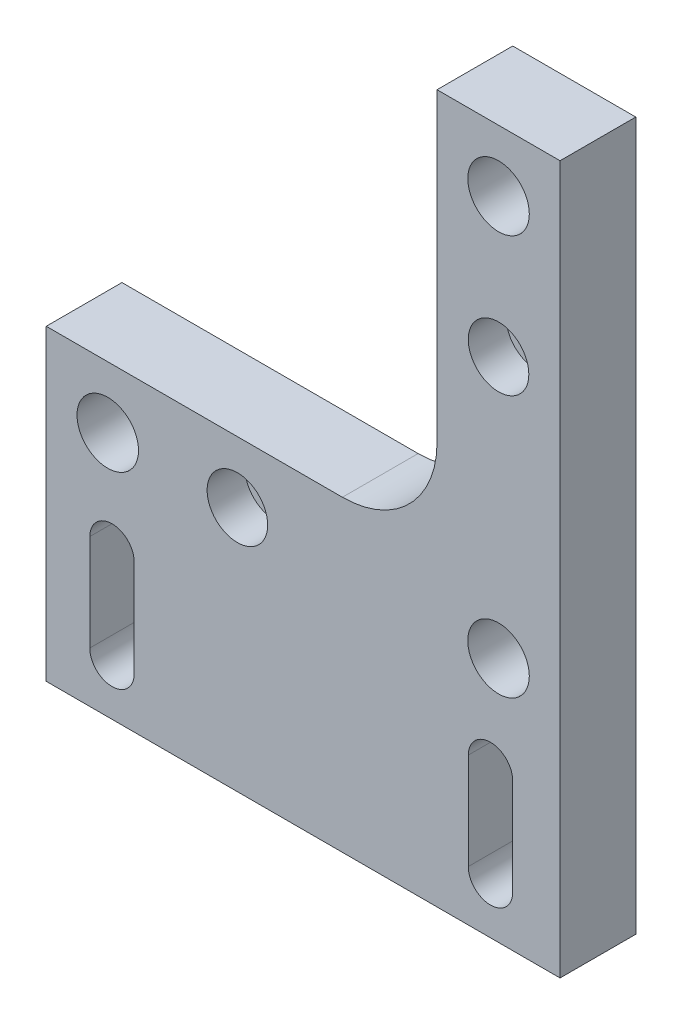
ISO-10303-21;
HEADER;
FILE_DESCRIPTION(('STEP AP214'),'2;1');
FILE_NAME('part.step','',(''),(''),'','','');
FILE_SCHEMA(('AUTOMOTIVE_DESIGN { 1 0 10303 214 1 1 1 1 }'));
ENDSEC;
DATA;
#1=APPLICATION_CONTEXT('core data for automotive mechanical design processes');
#2=APPLICATION_PROTOCOL_DEFINITION('international standard','automotive_design',2000,#1);
#3=PRODUCT_CONTEXT('',#1,'mechanical');
#4=PRODUCT('Part','Part','',(#3));
#5=PRODUCT_RELATED_PRODUCT_CATEGORY('part','',(#4));
#6=PRODUCT_DEFINITION_FORMATION('','',#4);
#7=PRODUCT_DEFINITION_CONTEXT('part definition',#1,'design');
#8=PRODUCT_DEFINITION('design','',#6,#7);
#9=PRODUCT_DEFINITION_SHAPE('','',#8);
#10=(LENGTH_UNIT() NAMED_UNIT(*) SI_UNIT(.MILLI.,.METRE.));
#11=(NAMED_UNIT(*) PLANE_ANGLE_UNIT() SI_UNIT($,.RADIAN.));
#12=(NAMED_UNIT(*) SI_UNIT($,.STERADIAN.) SOLID_ANGLE_UNIT());
#13=UNCERTAINTY_MEASURE_WITH_UNIT(LENGTH_MEASURE(1.E-05),#10,'distance_accuracy_value','');
#14=(GEOMETRIC_REPRESENTATION_CONTEXT(3) GLOBAL_UNCERTAINTY_ASSIGNED_CONTEXT((#13)) GLOBAL_UNIT_ASSIGNED_CONTEXT((#10,
#11,#12)) REPRESENTATION_CONTEXT('',''));
#15=CARTESIAN_POINT('',(0.,0.,0.));
#16=DIRECTION('',(0.,0.,1.));
#17=DIRECTION('',(1.,0.,0.));
#18=AXIS2_PLACEMENT_3D('',#15,#16,#17);
#19=CARTESIAN_POINT('',(20.2,26.,4.));
#20=DIRECTION('',(0.,0.,1.));
#21=DIRECTION('',(1.,0.,0.));
#22=AXIS2_PLACEMENT_3D('',#19,#20,#21);
#23=CYLINDRICAL_SURFACE('',#22,3.2);
#24=CARTESIAN_POINT('',(20.2,26.,4.));
#25=DIRECTION('',(0.,0.,1.));
#26=DIRECTION('',(1.,0.,0.));
#27=AXIS2_PLACEMENT_3D('',#24,#25,#26);
#28=CIRCLE('',#27,3.2);
#29=CARTESIAN_POINT('',(23.4,26.,4.));
#30=VERTEX_POINT('',#29);
#31=EDGE_CURVE('E324',#30,#30,#28,.T.);
#32=ORIENTED_EDGE('',*,*,#31,.F.);
#33=EDGE_LOOP('',(#32));
#34=FACE_BOUND('',#33,.T.);
#35=CARTESIAN_POINT('',(20.2,26.,8.));
#36=DIRECTION('',(0.,0.,1.));
#37=DIRECTION('',(1.,0.,0.));
#38=AXIS2_PLACEMENT_3D('',#35,#36,#37);
#39=CIRCLE('',#38,3.2);
#40=CARTESIAN_POINT('',(23.4,26.,8.));
#41=VERTEX_POINT('',#40);
#42=EDGE_CURVE('E11',#41,#41,#39,.T.);
#43=ORIENTED_EDGE('',*,*,#42,.T.);
#44=EDGE_LOOP('',(#43));
#45=FACE_BOUND('',#44,.T.);
#46=ADVANCED_FACE('F16',(#34,#45),#23,.F.);
#47=CARTESIAN_POINT('',(47.8,53.6,4.));
#48=DIRECTION('',(0.,0.,1.));
#49=DIRECTION('',(1.,0.,0.));
#50=AXIS2_PLACEMENT_3D('',#47,#48,#49);
#51=CYLINDRICAL_SURFACE('',#50,3.2);
#52=CARTESIAN_POINT('',(47.8,53.6,4.));
#53=DIRECTION('',(0.,0.,1.));
#54=DIRECTION('',(1.,0.,0.));
#55=AXIS2_PLACEMENT_3D('',#52,#53,#54);
#56=CIRCLE('',#55,3.2);
#57=CARTESIAN_POINT('',(51.,53.6,4.));
#58=VERTEX_POINT('',#57);
#59=EDGE_CURVE('E157',#58,#58,#56,.T.);
#60=ORIENTED_EDGE('',*,*,#59,.F.);
#61=EDGE_LOOP('',(#60));
#62=FACE_BOUND('',#61,.T.);
#63=CARTESIAN_POINT('',(47.8,53.6,8.));
#64=DIRECTION('',(0.,0.,1.));
#65=DIRECTION('',(1.,0.,0.));
#66=AXIS2_PLACEMENT_3D('',#63,#64,#65);
#67=CIRCLE('',#66,3.2);
#68=CARTESIAN_POINT('',(51.,53.6,8.));
#69=VERTEX_POINT('',#68);
#70=EDGE_CURVE('E26',#69,#69,#67,.T.);
#71=ORIENTED_EDGE('',*,*,#70,.T.);
#72=EDGE_LOOP('',(#71));
#73=FACE_BOUND('',#72,.T.);
#74=ADVANCED_FACE('F227',(#62,#73),#51,.F.);
#75=CARTESIAN_POINT('',(47.8,68.3,0.));
#76=DIRECTION('',(0.,0.,1.));
#77=DIRECTION('',(1.,0.,0.));
#78=AXIS2_PLACEMENT_3D('',#75,#76,#77);
#79=CYLINDRICAL_SURFACE('',#78,3.25);
#80=CARTESIAN_POINT('',(47.8,68.3,0.));
#81=DIRECTION('',(0.,0.,1.));
#82=DIRECTION('',(1.,0.,0.));
#83=AXIS2_PLACEMENT_3D('',#80,#81,#82);
#84=CIRCLE('',#83,3.25);
#85=CARTESIAN_POINT('',(51.05,68.3,0.));
#86=VERTEX_POINT('',#85);
#87=EDGE_CURVE('E560',#86,#86,#84,.T.);
#88=ORIENTED_EDGE('',*,*,#87,.F.);
#89=EDGE_LOOP('',(#88));
#90=FACE_BOUND('',#89,.T.);
#91=CARTESIAN_POINT('',(47.8,68.3,8.));
#92=DIRECTION('',(0.,0.,1.));
#93=DIRECTION('',(1.,0.,0.));
#94=AXIS2_PLACEMENT_3D('',#91,#92,#93);
#95=CIRCLE('',#94,3.25);
#96=CARTESIAN_POINT('',(51.05,68.3,8.));
#97=VERTEX_POINT('',#96);
#98=EDGE_CURVE('E570',#97,#97,#95,.T.);
#99=ORIENTED_EDGE('',*,*,#98,.T.);
#100=EDGE_LOOP('',(#99));
#101=FACE_BOUND('',#100,.T.);
#102=ADVANCED_FACE('F233',(#90,#101),#79,.F.);
#103=CARTESIAN_POINT('',(47.8,26.,0.));
#104=DIRECTION('',(0.,0.,1.));
#105=DIRECTION('',(1.,0.,0.));
#106=AXIS2_PLACEMENT_3D('',#103,#104,#105);
#107=CYLINDRICAL_SURFACE('',#106,3.25);
#108=CARTESIAN_POINT('',(47.8,26.,0.));
#109=DIRECTION('',(0.,0.,1.));
#110=DIRECTION('',(1.,0.,0.));
#111=AXIS2_PLACEMENT_3D('',#108,#109,#110);
#112=CIRCLE('',#111,3.25);
#113=CARTESIAN_POINT('',(51.05,26.,0.));
#114=VERTEX_POINT('',#113);
#115=EDGE_CURVE('E562',#114,#114,#112,.T.);
#116=ORIENTED_EDGE('',*,*,#115,.F.);
#117=EDGE_LOOP('',(#116));
#118=FACE_BOUND('',#117,.T.);
#119=CARTESIAN_POINT('',(47.8,26.,8.));
#120=DIRECTION('',(0.,0.,1.));
#121=DIRECTION('',(1.,0.,0.));
#122=AXIS2_PLACEMENT_3D('',#119,#120,#121);
#123=CIRCLE('',#122,3.25);
#124=CARTESIAN_POINT('',(51.05,26.,8.));
#125=VERTEX_POINT('',#124);
#126=EDGE_CURVE('E572',#125,#125,#123,.T.);
#127=ORIENTED_EDGE('',*,*,#126,.T.);
#128=EDGE_LOOP('',(#127));
#129=FACE_BOUND('',#128,.T.);
#130=ADVANCED_FACE('F249',(#118,#129),#107,.F.);
#131=CARTESIAN_POINT('',(6.5,26.,0.));
#132=DIRECTION('',(0.,0.,1.));
#133=DIRECTION('',(1.,0.,0.));
#134=AXIS2_PLACEMENT_3D('',#131,#132,#133);
#135=CYLINDRICAL_SURFACE('',#134,3.25);
#136=CARTESIAN_POINT('',(6.5,26.,0.));
#137=DIRECTION('',(0.,0.,1.));
#138=DIRECTION('',(1.,0.,0.));
#139=AXIS2_PLACEMENT_3D('',#136,#137,#138);
#140=CIRCLE('',#139,3.25);
#141=CARTESIAN_POINT('',(9.75,26.,0.));
#142=VERTEX_POINT('',#141);
#143=EDGE_CURVE('E190',#142,#142,#140,.T.);
#144=ORIENTED_EDGE('',*,*,#143,.F.);
#145=EDGE_LOOP('',(#144));
#146=FACE_BOUND('',#145,.T.);
#147=CARTESIAN_POINT('',(6.5,26.,8.));
#148=DIRECTION('',(0.,0.,1.));
#149=DIRECTION('',(1.,0.,0.));
#150=AXIS2_PLACEMENT_3D('',#147,#148,#149);
#151=CIRCLE('',#150,3.25);
#152=CARTESIAN_POINT('',(9.75,26.,8.));
#153=VERTEX_POINT('',#152);
#154=EDGE_CURVE('E340',#153,#153,#151,.T.);
#155=ORIENTED_EDGE('',*,*,#154,.T.);
#156=EDGE_LOOP('',(#155));
#157=FACE_BOUND('',#156,.T.);
#158=ADVANCED_FACE('F252',(#146,#157),#135,.F.);
#159=CARTESIAN_POINT('',(47.8,53.6,0.));
#160=DIRECTION('',(0.,0.,1.));
#161=DIRECTION('',(1.,0.,0.));
#162=AXIS2_PLACEMENT_3D('',#159,#160,#161);
#163=CYLINDRICAL_SURFACE('',#162,2.25);
#164=CARTESIAN_POINT('',(47.8,53.6,0.));
#165=DIRECTION('',(0.,0.,1.));
#166=DIRECTION('',(1.,0.,0.));
#167=AXIS2_PLACEMENT_3D('',#164,#165,#166);
#168=CIRCLE('',#167,2.25);
#169=CARTESIAN_POINT('',(50.05,53.6,0.));
#170=VERTEX_POINT('',#169);
#171=EDGE_CURVE('E332',#170,#170,#168,.T.);
#172=ORIENTED_EDGE('',*,*,#171,.F.);
#173=EDGE_LOOP('',(#172));
#174=FACE_BOUND('',#173,.T.);
#175=CARTESIAN_POINT('',(47.8,53.6,4.));
#176=DIRECTION('',(0.,0.,-1.));
#177=DIRECTION('',(0.,-1.,0.));
#178=AXIS2_PLACEMENT_3D('',#175,#176,#177);
#179=CIRCLE('',#178,2.25);
#180=CARTESIAN_POINT('',(47.8,51.35,4.));
#181=VERTEX_POINT('',#180);
#182=EDGE_CURVE('E322',#181,#181,#179,.T.);
#183=ORIENTED_EDGE('',*,*,#182,.F.);
#184=EDGE_LOOP('',(#183));
#185=FACE_BOUND('',#184,.T.);
#186=ADVANCED_FACE('F240',(#174,#185),#163,.F.);
#187=CARTESIAN_POINT('',(20.2,26.,0.));
#188=DIRECTION('',(0.,0.,1.));
#189=DIRECTION('',(1.,0.,0.));
#190=AXIS2_PLACEMENT_3D('',#187,#188,#189);
#191=CYLINDRICAL_SURFACE('',#190,2.25);
#192=CARTESIAN_POINT('',(20.2,26.,0.));
#193=DIRECTION('',(0.,0.,1.));
#194=DIRECTION('',(1.,0.,0.));
#195=AXIS2_PLACEMENT_3D('',#192,#193,#194);
#196=CIRCLE('',#195,2.25);
#197=CARTESIAN_POINT('',(22.45,26.,0.));
#198=VERTEX_POINT('',#197);
#199=EDGE_CURVE('E186',#198,#198,#196,.T.);
#200=ORIENTED_EDGE('',*,*,#199,.F.);
#201=EDGE_LOOP('',(#200));
#202=FACE_BOUND('',#201,.T.);
#203=CARTESIAN_POINT('',(20.2,26.,4.));
#204=DIRECTION('',(0.,0.,-1.));
#205=DIRECTION('',(0.,-1.,0.));
#206=AXIS2_PLACEMENT_3D('',#203,#204,#205);
#207=CIRCLE('',#206,2.25);
#208=CARTESIAN_POINT('',(20.2,23.75,4.));
#209=VERTEX_POINT('',#208);
#210=EDGE_CURVE('E328',#209,#209,#207,.T.);
#211=ORIENTED_EDGE('',*,*,#210,.F.);
#212=EDGE_LOOP('',(#211));
#213=FACE_BOUND('',#212,.T.);
#214=ADVANCED_FACE('F242',(#202,#213),#191,.F.);
#215=CARTESIAN_POINT('',(0.,32.5,8.));
#216=DIRECTION('',(1.,0.,0.));
#217=DIRECTION('',(0.,1.,0.));
#218=AXIS2_PLACEMENT_3D('',#215,#216,#217);
#219=PLANE('',#218);
#220=DIRECTION('',(0.,-1.,0.));
#221=VECTOR('',#220,1.);
#222=CARTESIAN_POINT('',(0.,32.5,0.));
#223=LINE('',#222,#221);
#224=CARTESIAN_POINT('',(0.,32.5,0.));
#225=VERTEX_POINT('',#224);
#226=CARTESIAN_POINT('',(0.,0.,0.));
#227=VERTEX_POINT('',#226);
#228=EDGE_CURVE('E338',#225,#227,#223,.T.);
#229=ORIENTED_EDGE('',*,*,#228,.T.);
#230=DIRECTION('',(0.,0.,-1.));
#231=VECTOR('',#230,1.);
#232=CARTESIAN_POINT('',(0.,0.,8.));
#233=LINE('',#232,#231);
#234=CARTESIAN_POINT('',(0.,0.,8.));
#235=VERTEX_POINT('',#234);
#236=EDGE_CURVE('E35',#235,#227,#233,.T.);
#237=ORIENTED_EDGE('',*,*,#236,.F.);
#238=DIRECTION('',(0.,-1.,0.));
#239=VECTOR('',#238,1.);
#240=CARTESIAN_POINT('',(0.,32.5,8.));
#241=LINE('',#240,#239);
#242=CARTESIAN_POINT('',(0.,32.5,8.));
#243=VERTEX_POINT('',#242);
#244=EDGE_CURVE('E345',#243,#235,#241,.T.);
#245=ORIENTED_EDGE('',*,*,#244,.F.);
#246=DIRECTION('',(0.,0.,-1.));
#247=VECTOR('',#246,1.);
#248=CARTESIAN_POINT('',(0.,32.5,8.));
#249=LINE('',#248,#247);
#250=EDGE_CURVE('E341',#243,#225,#249,.T.);
#251=ORIENTED_EDGE('',*,*,#250,.T.);
#252=EDGE_LOOP('',(#229,#237,#245,#251));
#253=FACE_BOUND('',#252,.T.);
#254=ADVANCED_FACE('F245',(#253),#219,.F.);
#255=CARTESIAN_POINT('',(0.,0.,8.));
#256=DIRECTION('',(0.,1.,0.));
#257=DIRECTION('',(0.,0.,1.));
#258=AXIS2_PLACEMENT_3D('',#255,#256,#257);
#259=PLANE('',#258);
#260=DIRECTION('',(1.,0.,0.));
#261=VECTOR('',#260,1.);
#262=CARTESIAN_POINT('',(0.,0.,0.));
#263=LINE('',#262,#261);
#264=CARTESIAN_POINT('',(54.3,0.,0.));
#265=VERTEX_POINT('',#264);
#266=EDGE_CURVE('E343',#227,#265,#263,.T.);
#267=ORIENTED_EDGE('',*,*,#266,.T.);
#268=DIRECTION('',(0.,0.,-1.));
#269=VECTOR('',#268,1.);
#270=CARTESIAN_POINT('',(54.3,0.,8.));
#271=LINE('',#270,#269);
#272=CARTESIAN_POINT('',(54.3,0.,8.));
#273=VERTEX_POINT('',#272);
#274=EDGE_CURVE('E351',#273,#265,#271,.T.);
#275=ORIENTED_EDGE('',*,*,#274,.F.);
#276=DIRECTION('',(1.,0.,0.));
#277=VECTOR('',#276,1.);
#278=CARTESIAN_POINT('',(0.,0.,8.));
#279=LINE('',#278,#277);
#280=EDGE_CURVE('E347',#235,#273,#279,.T.);
#281=ORIENTED_EDGE('',*,*,#280,.F.);
#282=ORIENTED_EDGE('',*,*,#236,.T.);
#283=EDGE_LOOP('',(#267,#275,#281,#282));
#284=FACE_BOUND('',#283,.T.);
#285=ADVANCED_FACE('F379',(#284),#259,.F.);
#286=CARTESIAN_POINT('',(54.3,0.,8.));
#287=DIRECTION('',(-1.,0.,0.));
#288=DIRECTION('',(0.,0.,1.));
#289=AXIS2_PLACEMENT_3D('',#286,#287,#288);
#290=PLANE('',#289);
#291=DIRECTION('',(0.,1.,0.));
#292=VECTOR('',#291,1.);
#293=CARTESIAN_POINT('',(54.3,0.,0.));
#294=LINE('',#293,#292);
#295=CARTESIAN_POINT('',(54.3,74.8,0.));
#296=VERTEX_POINT('',#295);
#297=EDGE_CURVE('E344',#265,#296,#294,.T.);
#298=ORIENTED_EDGE('',*,*,#297,.T.);
#299=DIRECTION('',(0.,0.,-1.));
#300=VECTOR('',#299,1.);
#301=CARTESIAN_POINT('',(54.3,74.8,8.));
#302=LINE('',#301,#300);
#303=CARTESIAN_POINT('',(54.3,74.8,8.));
#304=VERTEX_POINT('',#303);
#305=EDGE_CURVE('E358',#304,#296,#302,.T.);
#306=ORIENTED_EDGE('',*,*,#305,.F.);
#307=DIRECTION('',(0.,1.,0.));
#308=VECTOR('',#307,1.);
#309=CARTESIAN_POINT('',(54.3,0.,8.));
#310=LINE('',#309,#308);
#311=EDGE_CURVE('E355',#273,#304,#310,.T.);
#312=ORIENTED_EDGE('',*,*,#311,.F.);
#313=ORIENTED_EDGE('',*,*,#274,.T.);
#314=EDGE_LOOP('',(#298,#306,#312,#313));
#315=FACE_BOUND('',#314,.T.);
#316=ADVANCED_FACE('F381',(#315),#290,.F.);
#317=CARTESIAN_POINT('',(54.3,74.8,8.));
#318=DIRECTION('',(0.,-1.,0.));
#319=DIRECTION('',(0.,0.,-1.));
#320=AXIS2_PLACEMENT_3D('',#317,#318,#319);
#321=PLANE('',#320);
#322=DIRECTION('',(-1.,0.,0.));
#323=VECTOR('',#322,1.);
#324=CARTESIAN_POINT('',(54.3,74.8,0.));
#325=LINE('',#324,#323);
#326=CARTESIAN_POINT('',(41.3,74.8,0.));
#327=VERTEX_POINT('',#326);
#328=EDGE_CURVE('E353',#296,#327,#325,.T.);
#329=ORIENTED_EDGE('',*,*,#328,.T.);
#330=DIRECTION('',(0.,0.,-1.));
#331=VECTOR('',#330,1.);
#332=CARTESIAN_POINT('',(41.3,74.8,8.));
#333=LINE('',#332,#331);
#334=CARTESIAN_POINT('',(41.3,74.8,8.));
#335=VERTEX_POINT('',#334);
#336=EDGE_CURVE('E364',#335,#327,#333,.T.);
#337=ORIENTED_EDGE('',*,*,#336,.F.);
#338=DIRECTION('',(-1.,0.,0.));
#339=VECTOR('',#338,1.);
#340=CARTESIAN_POINT('',(54.3,74.8,8.));
#341=LINE('',#340,#339);
#342=EDGE_CURVE('E290',#304,#335,#341,.T.);
#343=ORIENTED_EDGE('',*,*,#342,.F.);
#344=ORIENTED_EDGE('',*,*,#305,.T.);
#345=EDGE_LOOP('',(#329,#337,#343,#344));
#346=FACE_BOUND('',#345,.T.);
#347=ADVANCED_FACE('F386',(#346),#321,.F.);
#348=CARTESIAN_POINT('',(41.3,74.8,8.));
#349=DIRECTION('',(1.,0.,0.));
#350=DIRECTION('',(0.,1.,0.));
#351=AXIS2_PLACEMENT_3D('',#348,#349,#350);
#352=PLANE('',#351);
#353=DIRECTION('',(0.,-1.,0.));
#354=VECTOR('',#353,1.);
#355=CARTESIAN_POINT('',(41.3,74.8,0.));
#356=LINE('',#355,#354);
#357=CARTESIAN_POINT('',(41.3,42.5,0.));
#358=VERTEX_POINT('',#357);
#359=EDGE_CURVE('E360',#327,#358,#356,.T.);
#360=ORIENTED_EDGE('',*,*,#359,.T.);
#361=DIRECTION('',(0.,0.,1.));
#362=VECTOR('',#361,1.);
#363=CARTESIAN_POINT('',(41.3,42.5,8.));
#364=LINE('',#363,#362);
#365=CARTESIAN_POINT('',(41.3,42.5,8.));
#366=VERTEX_POINT('',#365);
#367=EDGE_CURVE('E283',#358,#366,#364,.T.);
#368=ORIENTED_EDGE('',*,*,#367,.T.);
#369=DIRECTION('',(0.,-1.,0.));
#370=VECTOR('',#369,1.);
#371=CARTESIAN_POINT('',(41.3,74.8,8.));
#372=LINE('',#371,#370);
#373=EDGE_CURVE('E288',#335,#366,#372,.T.);
#374=ORIENTED_EDGE('',*,*,#373,.F.);
#375=ORIENTED_EDGE('',*,*,#336,.T.);
#376=EDGE_LOOP('',(#360,#368,#374,#375));
#377=FACE_BOUND('',#376,.T.);
#378=ADVANCED_FACE('F222',(#377),#352,.F.);
#379=CARTESIAN_POINT('',(41.3,32.5,8.));
#380=DIRECTION('',(0.,-1.,0.));
#381=DIRECTION('',(1.,0.,0.));
#382=AXIS2_PLACEMENT_3D('',#379,#380,#381);
#383=PLANE('',#382);
#384=DIRECTION('',(-1.,0.,0.));
#385=VECTOR('',#384,1.);
#386=CARTESIAN_POINT('',(41.3,32.5,8.));
#387=LINE('',#386,#385);
#388=CARTESIAN_POINT('',(31.3,32.5,8.));
#389=VERTEX_POINT('',#388);
#390=EDGE_CURVE('E185',#389,#243,#387,.T.);
#391=ORIENTED_EDGE('',*,*,#390,.F.);
#392=DIRECTION('',(0.,0.,-1.));
#393=VECTOR('',#392,1.);
#394=CARTESIAN_POINT('',(31.3,32.5,0.));
#395=LINE('',#394,#393);
#396=CARTESIAN_POINT('',(31.3,32.5,0.));
#397=VERTEX_POINT('',#396);
#398=EDGE_CURVE('E286',#389,#397,#395,.T.);
#399=ORIENTED_EDGE('',*,*,#398,.T.);
#400=DIRECTION('',(-1.,0.,0.));
#401=VECTOR('',#400,1.);
#402=CARTESIAN_POINT('',(41.3,32.5,0.));
#403=LINE('',#402,#401);
#404=EDGE_CURVE('E294',#397,#225,#403,.T.);
#405=ORIENTED_EDGE('',*,*,#404,.T.);
#406=ORIENTED_EDGE('',*,*,#250,.F.);
#407=EDGE_LOOP('',(#391,#399,#405,#406));
#408=FACE_BOUND('',#407,.T.);
#409=ADVANCED_FACE('F212',(#408),#383,.F.);
#410=CARTESIAN_POINT('',(0.,0.,8.));
#411=DIRECTION('',(0.,0.,1.));
#412=DIRECTION('',(1.,0.,0.));
#413=AXIS2_PLACEMENT_3D('',#410,#411,#412);
#414=PLANE('',#413);
#415=ORIENTED_EDGE('',*,*,#244,.T.);
#416=ORIENTED_EDGE('',*,*,#280,.T.);
#417=ORIENTED_EDGE('',*,*,#311,.T.);
#418=ORIENTED_EDGE('',*,*,#342,.T.);
#419=ORIENTED_EDGE('',*,*,#373,.T.);
#420=CARTESIAN_POINT('',(31.3,42.5,8.));
#421=DIRECTION('',(0.,0.,-1.));
#422=DIRECTION('',(0.,-1.,0.));
#423=AXIS2_PLACEMENT_3D('',#420,#421,#422);
#424=CIRCLE('',#423,10.);
#425=EDGE_CURVE('E280',#366,#389,#424,.T.);
#426=ORIENTED_EDGE('',*,*,#425,.T.);
#427=ORIENTED_EDGE('',*,*,#390,.T.);
#428=EDGE_LOOP('',(#415,#416,#417,#418,#419,#426,#427));
#429=FACE_BOUND('',#428,.T.);
#430=ORIENTED_EDGE('',*,*,#42,.F.);
#431=EDGE_LOOP('',(#430));
#432=FACE_BOUND('',#431,.T.);
#433=ORIENTED_EDGE('',*,*,#70,.F.);
#434=EDGE_LOOP('',(#433));
#435=FACE_BOUND('',#434,.T.);
#436=ORIENTED_EDGE('',*,*,#98,.F.);
#437=EDGE_LOOP('',(#436));
#438=FACE_BOUND('',#437,.T.);
#439=ORIENTED_EDGE('',*,*,#126,.F.);
#440=EDGE_LOOP('',(#439));
#441=FACE_BOUND('',#440,.T.);
#442=ORIENTED_EDGE('',*,*,#154,.F.);
#443=EDGE_LOOP('',(#442));
#444=FACE_BOUND('',#443,.T.);
#445=CARTESIAN_POINT('',(6.95,15.55,8.));
#446=DIRECTION('',(0.,0.,1.));
#447=DIRECTION('',(1.,0.,0.));
#448=AXIS2_PLACEMENT_3D('',#445,#446,#447);
#449=CIRCLE('',#448,2.35);
#450=CARTESIAN_POINT('',(9.3,15.55,8.));
#451=VERTEX_POINT('',#450);
#452=CARTESIAN_POINT('',(4.6,15.55,8.));
#453=VERTEX_POINT('',#452);
#454=EDGE_CURVE('E160',#451,#453,#449,.T.);
#455=ORIENTED_EDGE('',*,*,#454,.F.);
#456=DIRECTION('',(0.,1.,0.));
#457=VECTOR('',#456,1.);
#458=CARTESIAN_POINT('',(9.3,15.55,8.));
#459=LINE('',#458,#457);
#460=CARTESIAN_POINT('',(9.29999999999999,5.34999999999999,8.));
#461=VERTEX_POINT('',#460);
#462=EDGE_CURVE('E161',#461,#451,#459,.T.);
#463=ORIENTED_EDGE('',*,*,#462,.F.);
#464=CARTESIAN_POINT('',(6.95,5.35,8.));
#465=DIRECTION('',(0.,0.,1.));
#466=DIRECTION('',(1.,0.,0.));
#467=AXIS2_PLACEMENT_3D('',#464,#465,#466);
#468=CIRCLE('',#467,2.35);
#469=CARTESIAN_POINT('',(4.6,5.35,8.));
#470=VERTEX_POINT('',#469);
#471=EDGE_CURVE('E164',#470,#461,#468,.T.);
#472=ORIENTED_EDGE('',*,*,#471,.F.);
#473=DIRECTION('',(0.,-1.,0.));
#474=VECTOR('',#473,1.);
#475=CARTESIAN_POINT('',(4.6,15.55,8.));
#476=LINE('',#475,#474);
#477=EDGE_CURVE('E156',#453,#470,#476,.T.);
#478=ORIENTED_EDGE('',*,*,#477,.F.);
#479=EDGE_LOOP('',(#455,#463,#472,#478));
#480=FACE_BOUND('',#479,.T.);
#481=CARTESIAN_POINT('',(46.95,15.55,8.));
#482=DIRECTION('',(0.,0.,1.));
#483=DIRECTION('',(1.,0.,0.));
#484=AXIS2_PLACEMENT_3D('',#481,#482,#483);
#485=CIRCLE('',#484,2.35000000000001);
#486=CARTESIAN_POINT('',(49.3,15.55,8.));
#487=VERTEX_POINT('',#486);
#488=CARTESIAN_POINT('',(44.6,15.55,8.));
#489=VERTEX_POINT('',#488);
#490=EDGE_CURVE('E136',#487,#489,#485,.T.);
#491=ORIENTED_EDGE('',*,*,#490,.F.);
#492=DIRECTION('',(0.,1.,0.));
#493=VECTOR('',#492,1.);
#494=CARTESIAN_POINT('',(49.3,15.55,8.));
#495=LINE('',#494,#493);
#496=CARTESIAN_POINT('',(49.3,5.35,8.));
#497=VERTEX_POINT('',#496);
#498=EDGE_CURVE('E180',#497,#487,#495,.T.);
#499=ORIENTED_EDGE('',*,*,#498,.F.);
#500=CARTESIAN_POINT('',(46.95,5.35,8.));
#501=DIRECTION('',(0.,0.,1.));
#502=DIRECTION('',(1.,0.,0.));
#503=AXIS2_PLACEMENT_3D('',#500,#501,#502);
#504=CIRCLE('',#503,2.35000000000001);
#505=CARTESIAN_POINT('',(44.6,5.35,8.));
#506=VERTEX_POINT('',#505);
#507=EDGE_CURVE('E145',#506,#497,#504,.T.);
#508=ORIENTED_EDGE('',*,*,#507,.F.);
#509=DIRECTION('',(0.,-1.,0.));
#510=VECTOR('',#509,1.);
#511=CARTESIAN_POINT('',(44.6,15.55,8.));
#512=LINE('',#511,#510);
#513=EDGE_CURVE('E143',#489,#506,#512,.T.);
#514=ORIENTED_EDGE('',*,*,#513,.F.);
#515=EDGE_LOOP('',(#491,#499,#508,#514));
#516=FACE_BOUND('',#515,.T.);
#517=ADVANCED_FACE('F210',(#429,#432,#435,#438,#441,#444,#480,#516),#414,.T.);
#518=CARTESIAN_POINT('',(0.,0.,0.));
#519=DIRECTION('',(0.,0.,1.));
#520=DIRECTION('',(1.,0.,0.));
#521=AXIS2_PLACEMENT_3D('',#518,#519,#520);
#522=PLANE('',#521);
#523=ORIENTED_EDGE('',*,*,#228,.F.);
#524=ORIENTED_EDGE('',*,*,#404,.F.);
#525=CARTESIAN_POINT('',(31.3,42.5,0.));
#526=DIRECTION('',(0.,0.,1.));
#527=DIRECTION('',(1.,0.,0.));
#528=AXIS2_PLACEMENT_3D('',#525,#526,#527);
#529=CIRCLE('',#528,10.);
#530=EDGE_CURVE('E182',#397,#358,#529,.T.);
#531=ORIENTED_EDGE('',*,*,#530,.T.);
#532=ORIENTED_EDGE('',*,*,#359,.F.);
#533=ORIENTED_EDGE('',*,*,#328,.F.);
#534=ORIENTED_EDGE('',*,*,#297,.F.);
#535=ORIENTED_EDGE('',*,*,#266,.F.);
#536=EDGE_LOOP('',(#523,#524,#531,#532,#533,#534,#535));
#537=FACE_BOUND('',#536,.T.);
#538=ORIENTED_EDGE('',*,*,#199,.T.);
#539=EDGE_LOOP('',(#538));
#540=FACE_BOUND('',#539,.T.);
#541=ORIENTED_EDGE('',*,*,#171,.T.);
#542=EDGE_LOOP('',(#541));
#543=FACE_BOUND('',#542,.T.);
#544=ORIENTED_EDGE('',*,*,#87,.T.);
#545=EDGE_LOOP('',(#544));
#546=FACE_BOUND('',#545,.T.);
#547=ORIENTED_EDGE('',*,*,#115,.T.);
#548=EDGE_LOOP('',(#547));
#549=FACE_BOUND('',#548,.T.);
#550=ORIENTED_EDGE('',*,*,#143,.T.);
#551=EDGE_LOOP('',(#550));
#552=FACE_BOUND('',#551,.T.);
#553=DIRECTION('',(0.,1.,0.));
#554=VECTOR('',#553,1.);
#555=CARTESIAN_POINT('',(9.3,15.55,0.));
#556=LINE('',#555,#554);
#557=CARTESIAN_POINT('',(9.29999999999999,5.34999999999999,0.));
#558=VERTEX_POINT('',#557);
#559=CARTESIAN_POINT('',(9.3,15.55,0.));
#560=VERTEX_POINT('',#559);
#561=EDGE_CURVE('E187',#558,#560,#556,.T.);
#562=ORIENTED_EDGE('',*,*,#561,.T.);
#563=CARTESIAN_POINT('',(6.95,15.55,0.));
#564=DIRECTION('',(0.,0.,1.));
#565=DIRECTION('',(1.,0.,0.));
#566=AXIS2_PLACEMENT_3D('',#563,#564,#565);
#567=CIRCLE('',#566,2.35);
#568=CARTESIAN_POINT('',(4.6,15.55,0.));
#569=VERTEX_POINT('',#568);
#570=EDGE_CURVE('E191',#560,#569,#567,.T.);
#571=ORIENTED_EDGE('',*,*,#570,.T.);
#572=DIRECTION('',(0.,-1.,0.));
#573=VECTOR('',#572,1.);
#574=CARTESIAN_POINT('',(4.6,15.55,0.));
#575=LINE('',#574,#573);
#576=CARTESIAN_POINT('',(4.6,5.35,0.));
#577=VERTEX_POINT('',#576);
#578=EDGE_CURVE('E194',#569,#577,#575,.T.);
#579=ORIENTED_EDGE('',*,*,#578,.T.);
#580=CARTESIAN_POINT('',(6.95,5.35,0.));
#581=DIRECTION('',(0.,0.,1.));
#582=DIRECTION('',(1.,0.,0.));
#583=AXIS2_PLACEMENT_3D('',#580,#581,#582);
#584=CIRCLE('',#583,2.35);
#585=EDGE_CURVE('E197',#577,#558,#584,.T.);
#586=ORIENTED_EDGE('',*,*,#585,.T.);
#587=EDGE_LOOP('',(#562,#571,#579,#586));
#588=FACE_BOUND('',#587,.T.);
#589=DIRECTION('',(0.,1.,0.));
#590=VECTOR('',#589,1.);
#591=CARTESIAN_POINT('',(49.3,15.55,0.));
#592=LINE('',#591,#590);
#593=CARTESIAN_POINT('',(49.3,5.35,0.));
#594=VERTEX_POINT('',#593);
#595=CARTESIAN_POINT('',(49.3,15.55,0.));
#596=VERTEX_POINT('',#595);
#597=EDGE_CURVE('E199',#594,#596,#592,.T.);
#598=ORIENTED_EDGE('',*,*,#597,.T.);
#599=CARTESIAN_POINT('',(46.95,15.55,0.));
#600=DIRECTION('',(0.,0.,1.));
#601=DIRECTION('',(1.,0.,0.));
#602=AXIS2_PLACEMENT_3D('',#599,#600,#601);
#603=CIRCLE('',#602,2.35000000000001);
#604=CARTESIAN_POINT('',(44.6,15.55,0.));
#605=VERTEX_POINT('',#604);
#606=EDGE_CURVE('E139',#596,#605,#603,.T.);
#607=ORIENTED_EDGE('',*,*,#606,.T.);
#608=DIRECTION('',(0.,-1.,0.));
#609=VECTOR('',#608,1.);
#610=CARTESIAN_POINT('',(44.6,15.55,0.));
#611=LINE('',#610,#609);
#612=CARTESIAN_POINT('',(44.6,5.35,0.));
#613=VERTEX_POINT('',#612);
#614=EDGE_CURVE('E122',#605,#613,#611,.T.);
#615=ORIENTED_EDGE('',*,*,#614,.T.);
#616=CARTESIAN_POINT('',(46.95,5.35,0.));
#617=DIRECTION('',(0.,0.,1.));
#618=DIRECTION('',(1.,0.,0.));
#619=AXIS2_PLACEMENT_3D('',#616,#617,#618);
#620=CIRCLE('',#619,2.35000000000001);
#621=EDGE_CURVE('E128',#613,#594,#620,.T.);
#622=ORIENTED_EDGE('',*,*,#621,.T.);
#623=EDGE_LOOP('',(#598,#607,#615,#622));
#624=FACE_BOUND('',#623,.T.);
#625=ADVANCED_FACE('F138',(#537,#540,#543,#546,#549,#552,#588,#624),#522,.F.);
#626=CARTESIAN_POINT('',(46.95,15.55,0.));
#627=DIRECTION('',(0.,0.,1.));
#628=DIRECTION('',(1.,0.,0.));
#629=AXIS2_PLACEMENT_3D('',#626,#627,#628);
#630=CYLINDRICAL_SURFACE('',#629,2.35000000000001);
#631=ORIENTED_EDGE('',*,*,#490,.T.);
#632=DIRECTION('',(0.,0.,1.));
#633=VECTOR('',#632,1.);
#634=CARTESIAN_POINT('',(44.6,15.55,0.));
#635=LINE('',#634,#633);
#636=EDGE_CURVE('E148',#605,#489,#635,.T.);
#637=ORIENTED_EDGE('',*,*,#636,.F.);
#638=ORIENTED_EDGE('',*,*,#606,.F.);
#639=DIRECTION('',(0.,0.,1.));
#640=VECTOR('',#639,1.);
#641=CARTESIAN_POINT('',(49.3,15.55,0.));
#642=LINE('',#641,#640);
#643=EDGE_CURVE('E179',#596,#487,#642,.T.);
#644=ORIENTED_EDGE('',*,*,#643,.T.);
#645=EDGE_LOOP('',(#631,#637,#638,#644));
#646=FACE_BOUND('',#645,.T.);
#647=ADVANCED_FACE('F18',(#646),#630,.F.);
#648=CARTESIAN_POINT('',(49.3,15.55,0.));
#649=DIRECTION('',(1.,0.,0.));
#650=DIRECTION('',(0.,1.,0.));
#651=AXIS2_PLACEMENT_3D('',#648,#649,#650);
#652=PLANE('',#651);
#653=ORIENTED_EDGE('',*,*,#498,.T.);
#654=ORIENTED_EDGE('',*,*,#643,.F.);
#655=ORIENTED_EDGE('',*,*,#597,.F.);
#656=DIRECTION('',(0.,0.,1.));
#657=VECTOR('',#656,1.);
#658=CARTESIAN_POINT('',(49.3,5.35,0.));
#659=LINE('',#658,#657);
#660=EDGE_CURVE('E132',#594,#497,#659,.T.);
#661=ORIENTED_EDGE('',*,*,#660,.T.);
#662=EDGE_LOOP('',(#653,#654,#655,#661));
#663=FACE_BOUND('',#662,.T.);
#664=ADVANCED_FACE('F207',(#663),#652,.F.);
#665=CARTESIAN_POINT('',(46.95,5.35,0.));
#666=DIRECTION('',(0.,0.,1.));
#667=DIRECTION('',(1.,0.,0.));
#668=AXIS2_PLACEMENT_3D('',#665,#666,#667);
#669=CYLINDRICAL_SURFACE('',#668,2.35000000000001);
#670=ORIENTED_EDGE('',*,*,#507,.T.);
#671=ORIENTED_EDGE('',*,*,#660,.F.);
#672=ORIENTED_EDGE('',*,*,#621,.F.);
#673=DIRECTION('',(0.,0.,1.));
#674=VECTOR('',#673,1.);
#675=CARTESIAN_POINT('',(44.6,5.35,0.));
#676=LINE('',#675,#674);
#677=EDGE_CURVE('E130',#613,#506,#676,.T.);
#678=ORIENTED_EDGE('',*,*,#677,.T.);
#679=EDGE_LOOP('',(#670,#671,#672,#678));
#680=FACE_BOUND('',#679,.T.);
#681=ADVANCED_FACE('F129',(#680),#669,.F.);
#682=CARTESIAN_POINT('',(44.6,15.55,0.));
#683=DIRECTION('',(-1.,0.,0.));
#684=DIRECTION('',(0.,0.,1.));
#685=AXIS2_PLACEMENT_3D('',#682,#683,#684);
#686=PLANE('',#685);
#687=ORIENTED_EDGE('',*,*,#513,.T.);
#688=ORIENTED_EDGE('',*,*,#677,.F.);
#689=ORIENTED_EDGE('',*,*,#614,.F.);
#690=ORIENTED_EDGE('',*,*,#636,.T.);
#691=EDGE_LOOP('',(#687,#688,#689,#690));
#692=FACE_BOUND('',#691,.T.);
#693=ADVANCED_FACE('F142',(#692),#686,.F.);
#694=CARTESIAN_POINT('',(6.95,15.55,0.));
#695=DIRECTION('',(0.,0.,1.));
#696=DIRECTION('',(1.,0.,0.));
#697=AXIS2_PLACEMENT_3D('',#694,#695,#696);
#698=CYLINDRICAL_SURFACE('',#697,2.35);
#699=ORIENTED_EDGE('',*,*,#454,.T.);
#700=DIRECTION('',(0.,0.,1.));
#701=VECTOR('',#700,1.);
#702=CARTESIAN_POINT('',(4.6,15.55,0.));
#703=LINE('',#702,#701);
#704=EDGE_CURVE('E153',#569,#453,#703,.T.);
#705=ORIENTED_EDGE('',*,*,#704,.F.);
#706=ORIENTED_EDGE('',*,*,#570,.F.);
#707=DIRECTION('',(0.,0.,1.));
#708=VECTOR('',#707,1.);
#709=CARTESIAN_POINT('',(9.3,15.55,0.));
#710=LINE('',#709,#708);
#711=EDGE_CURVE('E158',#560,#451,#710,.T.);
#712=ORIENTED_EDGE('',*,*,#711,.T.);
#713=EDGE_LOOP('',(#699,#705,#706,#712));
#714=FACE_BOUND('',#713,.T.);
#715=ADVANCED_FACE('F260',(#714),#698,.F.);
#716=CARTESIAN_POINT('',(9.3,15.55,0.));
#717=DIRECTION('',(1.,0.,0.));
#718=DIRECTION('',(0.,1.,0.));
#719=AXIS2_PLACEMENT_3D('',#716,#717,#718);
#720=PLANE('',#719);
#721=ORIENTED_EDGE('',*,*,#462,.T.);
#722=ORIENTED_EDGE('',*,*,#711,.F.);
#723=ORIENTED_EDGE('',*,*,#561,.F.);
#724=DIRECTION('',(0.,0.,1.));
#725=VECTOR('',#724,1.);
#726=CARTESIAN_POINT('',(9.29999999999999,5.34999999999999,0.));
#727=LINE('',#726,#725);
#728=EDGE_CURVE('E162',#558,#461,#727,.T.);
#729=ORIENTED_EDGE('',*,*,#728,.T.);
#730=EDGE_LOOP('',(#721,#722,#723,#729));
#731=FACE_BOUND('',#730,.T.);
#732=ADVANCED_FACE('F263',(#731),#720,.F.);
#733=CARTESIAN_POINT('',(6.95,5.35,0.));
#734=DIRECTION('',(0.,0.,1.));
#735=DIRECTION('',(1.,0.,0.));
#736=AXIS2_PLACEMENT_3D('',#733,#734,#735);
#737=CYLINDRICAL_SURFACE('',#736,2.35);
#738=ORIENTED_EDGE('',*,*,#471,.T.);
#739=ORIENTED_EDGE('',*,*,#728,.F.);
#740=ORIENTED_EDGE('',*,*,#585,.F.);
#741=DIRECTION('',(0.,0.,1.));
#742=VECTOR('',#741,1.);
#743=CARTESIAN_POINT('',(4.6,5.35,0.));
#744=LINE('',#743,#742);
#745=EDGE_CURVE('E20',#577,#470,#744,.T.);
#746=ORIENTED_EDGE('',*,*,#745,.T.);
#747=EDGE_LOOP('',(#738,#739,#740,#746));
#748=FACE_BOUND('',#747,.T.);
#749=ADVANCED_FACE('F265',(#748),#737,.F.);
#750=CARTESIAN_POINT('',(4.6,15.55,0.));
#751=DIRECTION('',(-1.,0.,0.));
#752=DIRECTION('',(0.,-1.,0.));
#753=AXIS2_PLACEMENT_3D('',#750,#751,#752);
#754=PLANE('',#753);
#755=ORIENTED_EDGE('',*,*,#477,.T.);
#756=ORIENTED_EDGE('',*,*,#745,.F.);
#757=ORIENTED_EDGE('',*,*,#578,.F.);
#758=ORIENTED_EDGE('',*,*,#704,.T.);
#759=EDGE_LOOP('',(#755,#756,#757,#758));
#760=FACE_BOUND('',#759,.T.);
#761=ADVANCED_FACE('F267',(#760),#754,.F.);
#762=CARTESIAN_POINT('',(47.8,53.6,4.));
#763=DIRECTION('',(0.,0.,1.));
#764=DIRECTION('',(1.,0.,0.));
#765=AXIS2_PLACEMENT_3D('',#762,#763,#764);
#766=PLANE('',#765);
#767=ORIENTED_EDGE('',*,*,#59,.T.);
#768=EDGE_LOOP('',(#767));
#769=FACE_BOUND('',#768,.T.);
#770=ORIENTED_EDGE('',*,*,#182,.T.);
#771=EDGE_LOOP('',(#770));
#772=FACE_BOUND('',#771,.T.);
#773=ADVANCED_FACE('F275',(#769,#772),#766,.T.);
#774=CARTESIAN_POINT('',(20.2,26.,4.));
#775=DIRECTION('',(0.,0.,1.));
#776=DIRECTION('',(1.,0.,0.));
#777=AXIS2_PLACEMENT_3D('',#774,#775,#776);
#778=PLANE('',#777);
#779=ORIENTED_EDGE('',*,*,#31,.T.);
#780=EDGE_LOOP('',(#779));
#781=FACE_BOUND('',#780,.T.);
#782=ORIENTED_EDGE('',*,*,#210,.T.);
#783=EDGE_LOOP('',(#782));
#784=FACE_BOUND('',#783,.T.);
#785=ADVANCED_FACE('F270',(#781,#784),#778,.T.);
#786=CARTESIAN_POINT('',(31.3,42.5,8.));
#787=DIRECTION('',(0.,0.,1.));
#788=DIRECTION('',(1.,0.,0.));
#789=AXIS2_PLACEMENT_3D('',#786,#787,#788);
#790=CYLINDRICAL_SURFACE('',#789,10.);
#791=ORIENTED_EDGE('',*,*,#425,.F.);
#792=ORIENTED_EDGE('',*,*,#367,.F.);
#793=ORIENTED_EDGE('',*,*,#530,.F.);
#794=ORIENTED_EDGE('',*,*,#398,.F.);
#795=EDGE_LOOP('',(#791,#792,#793,#794));
#796=FACE_BOUND('',#795,.T.);
#797=ADVANCED_FACE('F268',(#796),#790,.F.);
#798=CLOSED_SHELL('',(#46,#74,#102,#130,#158,#186,#214,#254,#285,#316,#347,#378,#409,#517,#625,
#647,#664,#681,#693,#715,#732,#749,#761,#773,#785,#797));
#799=MANIFOLD_SOLID_BREP('B1',#798);
#800=ADVANCED_BREP_SHAPE_REPRESENTATION('',(#18,#799),#14);
#801=SHAPE_DEFINITION_REPRESENTATION(#9,#800);
ENDSEC;
END-ISO-10303-21;
